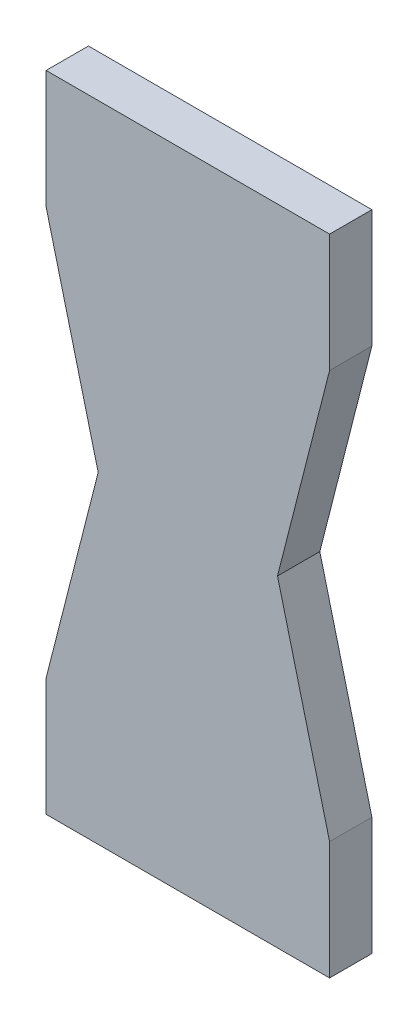
ISO-10303-21;
HEADER;
FILE_DESCRIPTION(('STEP AP214'),'2;1');
FILE_NAME('part.step','',(''),(''),'','','');
FILE_SCHEMA(('AUTOMOTIVE_DESIGN { 1 0 10303 214 1 1 1 1 }'));
ENDSEC;
DATA;
#1=APPLICATION_CONTEXT('core data for automotive mechanical design processes');
#2=APPLICATION_PROTOCOL_DEFINITION('international standard','automotive_design',2000,#1);
#3=PRODUCT_CONTEXT('',#1,'mechanical');
#4=PRODUCT('Part','Part','',(#3));
#5=PRODUCT_RELATED_PRODUCT_CATEGORY('part','',(#4));
#6=PRODUCT_DEFINITION_FORMATION('','',#4);
#7=PRODUCT_DEFINITION_CONTEXT('part definition',#1,'design');
#8=PRODUCT_DEFINITION('design','',#6,#7);
#9=PRODUCT_DEFINITION_SHAPE('','',#8);
#10=(LENGTH_UNIT() NAMED_UNIT(*) SI_UNIT(.MILLI.,.METRE.));
#11=(NAMED_UNIT(*) PLANE_ANGLE_UNIT() SI_UNIT($,.RADIAN.));
#12=(NAMED_UNIT(*) SI_UNIT($,.STERADIAN.) SOLID_ANGLE_UNIT());
#13=UNCERTAINTY_MEASURE_WITH_UNIT(LENGTH_MEASURE(1.E-05),#10,'distance_accuracy_value','');
#14=(GEOMETRIC_REPRESENTATION_CONTEXT(3) GLOBAL_UNCERTAINTY_ASSIGNED_CONTEXT((#13)) GLOBAL_UNIT_ASSIGNED_CONTEXT((#10,
#11,#12)) REPRESENTATION_CONTEXT('',''));
#15=CARTESIAN_POINT('',(0.,0.,0.));
#16=DIRECTION('',(0.,0.,1.));
#17=DIRECTION('',(1.,0.,0.));
#18=AXIS2_PLACEMENT_3D('',#15,#16,#17);
#19=CARTESIAN_POINT('',(25.6255105081812,6.5412487349831,1.97));
#20=DIRECTION('',(0.968930713030858,0.247332313589456,0.));
#21=DIRECTION('',(-0.247332313589456,0.968930713030858,0.));
#22=AXIS2_PLACEMENT_3D('',#19,#20,#21);
#23=PLANE('',#22);
#24=DIRECTION('',(0.247332313589456,-0.968930713030858,0.));
#25=VECTOR('',#24,1.);
#26=CARTESIAN_POINT('',(25.6255105081812,6.5412487349831,0.));
#27=LINE('',#26,#25);
#28=CARTESIAN_POINT('',(20.9826344025264,24.7298355406408,0.));
#29=VERTEX_POINT('',#28);
#30=CARTESIAN_POINT('',(23.4076344025264,15.2298355406408,0.));
#31=VERTEX_POINT('',#30);
#32=EDGE_CURVE('E144',#29,#31,#27,.T.);
#33=ORIENTED_EDGE('',*,*,#32,.F.);
#34=DIRECTION('',(0.,0.,-1.));
#35=VECTOR('',#34,1.);
#36=CARTESIAN_POINT('',(20.9826344025264,24.7298355406408,1.97));
#37=LINE('',#36,#35);
#38=CARTESIAN_POINT('',(20.9826344025264,24.7298355406408,1.97));
#39=VERTEX_POINT('',#38);
#40=EDGE_CURVE('E11',#39,#29,#37,.T.);
#41=ORIENTED_EDGE('',*,*,#40,.F.);
#42=DIRECTION('',(0.247332313589456,-0.968930713030858,0.));
#43=VECTOR('',#42,1.);
#44=CARTESIAN_POINT('',(25.6255105081812,6.5412487349831,1.97));
#45=LINE('',#44,#43);
#46=CARTESIAN_POINT('',(23.4076344025264,15.2298355406408,1.97));
#47=VERTEX_POINT('',#46);
#48=EDGE_CURVE('E197',#39,#47,#45,.T.);
#49=ORIENTED_EDGE('',*,*,#48,.T.);
#50=DIRECTION('',(0.,0.,-1.));
#51=VECTOR('',#50,1.);
#52=CARTESIAN_POINT('',(23.4076344025264,15.2298355406408,1.97));
#53=LINE('',#52,#51);
#54=EDGE_CURVE('E50',#47,#31,#53,.T.);
#55=ORIENTED_EDGE('',*,*,#54,.T.);
#56=EDGE_LOOP('',(#33,#41,#49,#55));
#57=FACE_BOUND('',#56,.T.);
#58=ADVANCED_FACE('F34',(#57),#23,.T.);
#59=CARTESIAN_POINT('',(13.7726054372423,-3.51563875634869,1.97));
#60=DIRECTION('',(-0.968930713030858,0.247332313589456,0.));
#61=DIRECTION('',(-0.247332313589456,-0.968930713030858,0.));
#62=AXIS2_PLACEMENT_3D('',#59,#60,#61);
#63=PLANE('',#62);
#64=DIRECTION('',(0.247332313589456,0.968930713030858,0.));
#65=VECTOR('',#64,1.);
#66=CARTESIAN_POINT('',(13.7726054372423,-3.51563875634869,0.));
#67=LINE('',#66,#65);
#68=CARTESIAN_POINT('',(23.4076344025265,34.2298355406408,0.));
#69=VERTEX_POINT('',#68);
#70=EDGE_CURVE('E146',#29,#69,#67,.T.);
#71=ORIENTED_EDGE('',*,*,#70,.T.);
#72=DIRECTION('',(0.,0.,-1.));
#73=VECTOR('',#72,1.);
#74=CARTESIAN_POINT('',(23.4076344025265,34.2298355406408,1.97));
#75=LINE('',#74,#73);
#76=CARTESIAN_POINT('',(23.4076344025265,34.2298355406408,1.97));
#77=VERTEX_POINT('',#76);
#78=EDGE_CURVE('E42',#77,#69,#75,.T.);
#79=ORIENTED_EDGE('',*,*,#78,.F.);
#80=DIRECTION('',(0.247332313589456,0.968930713030858,0.));
#81=VECTOR('',#80,1.);
#82=CARTESIAN_POINT('',(13.7726054372423,-3.51563875634869,1.97));
#83=LINE('',#82,#81);
#84=EDGE_CURVE('E195',#39,#77,#83,.T.);
#85=ORIENTED_EDGE('',*,*,#84,.F.);
#86=ORIENTED_EDGE('',*,*,#40,.T.);
#87=EDGE_LOOP('',(#71,#79,#85,#86));
#88=FACE_BOUND('',#87,.T.);
#89=ADVANCED_FACE('F184',(#88),#63,.F.);
#90=CARTESIAN_POINT('',(23.4076344025264,0.,1.97));
#91=DIRECTION('',(1.,0.,0.));
#92=DIRECTION('',(0.,0.,-1.));
#93=AXIS2_PLACEMENT_3D('',#90,#91,#92);
#94=PLANE('',#93);
#95=DIRECTION('',(0.,-1.,0.));
#96=VECTOR('',#95,1.);
#97=CARTESIAN_POINT('',(23.4076344025264,0.,0.));
#98=LINE('',#97,#96);
#99=CARTESIAN_POINT('',(23.4076344025264,39.7298355406408,0.));
#100=VERTEX_POINT('',#99);
#101=EDGE_CURVE('E149',#100,#69,#98,.T.);
#102=ORIENTED_EDGE('',*,*,#101,.F.);
#103=DIRECTION('',(0.,0.,-1.));
#104=VECTOR('',#103,1.);
#105=CARTESIAN_POINT('',(23.4076344025264,39.7298355406408,1.97));
#106=LINE('',#105,#104);
#107=CARTESIAN_POINT('',(23.4076344025264,39.7298355406408,1.97));
#108=VERTEX_POINT('',#107);
#109=EDGE_CURVE('E175',#108,#100,#106,.T.);
#110=ORIENTED_EDGE('',*,*,#109,.F.);
#111=DIRECTION('',(0.,-1.,0.));
#112=VECTOR('',#111,1.);
#113=CARTESIAN_POINT('',(23.4076344025264,0.,1.97));
#114=LINE('',#113,#112);
#115=EDGE_CURVE('E140',#108,#77,#114,.T.);
#116=ORIENTED_EDGE('',*,*,#115,.T.);
#117=ORIENTED_EDGE('',*,*,#78,.T.);
#118=EDGE_LOOP('',(#102,#110,#116,#117));
#119=FACE_BOUND('',#118,.T.);
#120=ADVANCED_FACE('F180',(#119),#94,.T.);
#121=CARTESIAN_POINT('',(0.,39.7298355406408,1.97));
#122=DIRECTION('',(0.,1.,0.));
#123=DIRECTION('',(0.,0.,1.));
#124=AXIS2_PLACEMENT_3D('',#121,#122,#123);
#125=PLANE('',#124);
#126=DIRECTION('',(1.,0.,0.));
#127=VECTOR('',#126,1.);
#128=CARTESIAN_POINT('',(0.,39.7298355406408,0.));
#129=LINE('',#128,#127);
#130=CARTESIAN_POINT('',(10.2076344025264,39.7298355406408,0.));
#131=VERTEX_POINT('',#130);
#132=EDGE_CURVE('E152',#131,#100,#129,.T.);
#133=ORIENTED_EDGE('',*,*,#132,.F.);
#134=DIRECTION('',(0.,0.,-1.));
#135=VECTOR('',#134,1.);
#136=CARTESIAN_POINT('',(10.2076344025264,39.7298355406408,1.97));
#137=LINE('',#136,#135);
#138=CARTESIAN_POINT('',(10.2076344025264,39.7298355406408,1.97));
#139=VERTEX_POINT('',#138);
#140=EDGE_CURVE('E173',#139,#131,#137,.T.);
#141=ORIENTED_EDGE('',*,*,#140,.F.);
#142=DIRECTION('',(1.,0.,0.));
#143=VECTOR('',#142,1.);
#144=CARTESIAN_POINT('',(0.,39.7298355406408,1.97));
#145=LINE('',#144,#143);
#146=EDGE_CURVE('E194',#139,#108,#145,.T.);
#147=ORIENTED_EDGE('',*,*,#146,.T.);
#148=ORIENTED_EDGE('',*,*,#109,.T.);
#149=EDGE_LOOP('',(#133,#141,#147,#148));
#150=FACE_BOUND('',#149,.T.);
#151=ADVANCED_FACE('F190',(#150),#125,.T.);
#152=CARTESIAN_POINT('',(10.2076344025264,0.,1.97));
#153=DIRECTION('',(1.,0.,0.));
#154=DIRECTION('',(0.,0.,-1.));
#155=AXIS2_PLACEMENT_3D('',#152,#153,#154);
#156=PLANE('',#155);
#157=DIRECTION('',(0.,-1.,0.));
#158=VECTOR('',#157,1.);
#159=CARTESIAN_POINT('',(10.2076344025264,0.,0.));
#160=LINE('',#159,#158);
#161=CARTESIAN_POINT('',(10.2076344025264,34.2298355406408,0.));
#162=VERTEX_POINT('',#161);
#163=EDGE_CURVE('E156',#131,#162,#160,.T.);
#164=ORIENTED_EDGE('',*,*,#163,.T.);
#165=DIRECTION('',(0.,0.,-1.));
#166=VECTOR('',#165,1.);
#167=CARTESIAN_POINT('',(10.2076344025264,34.2298355406408,1.97));
#168=LINE('',#167,#166);
#169=CARTESIAN_POINT('',(10.2076344025264,34.2298355406408,1.97));
#170=VERTEX_POINT('',#169);
#171=EDGE_CURVE('E171',#170,#162,#168,.T.);
#172=ORIENTED_EDGE('',*,*,#171,.F.);
#173=DIRECTION('',(0.,-1.,0.));
#174=VECTOR('',#173,1.);
#175=CARTESIAN_POINT('',(10.2076344025264,0.,1.97));
#176=LINE('',#175,#174);
#177=EDGE_CURVE('E126',#139,#170,#176,.T.);
#178=ORIENTED_EDGE('',*,*,#177,.F.);
#179=ORIENTED_EDGE('',*,*,#140,.T.);
#180=EDGE_LOOP('',(#164,#172,#178,#179));
#181=FACE_BOUND('',#180,.T.);
#182=ADVANCED_FACE('F207',(#181),#156,.F.);
#183=CARTESIAN_POINT('',(17.7863073406162,4.54018897905204,1.97));
#184=DIRECTION('',(-0.968930713030858,-0.247332313589456,0.));
#185=DIRECTION('',(0.247332313589456,-0.968930713030858,0.));
#186=AXIS2_PLACEMENT_3D('',#183,#184,#185);
#187=PLANE('',#186);
#188=DIRECTION('',(-0.247332313589456,0.968930713030858,0.));
#189=VECTOR('',#188,1.);
#190=CARTESIAN_POINT('',(17.7863073406162,4.54018897905204,0.));
#191=LINE('',#190,#189);
#192=CARTESIAN_POINT('',(12.6326344025264,24.7298355406408,0.));
#193=VERTEX_POINT('',#192);
#194=EDGE_CURVE('E159',#193,#162,#191,.T.);
#195=ORIENTED_EDGE('',*,*,#194,.F.);
#196=DIRECTION('',(0.,0.,-1.));
#197=VECTOR('',#196,1.);
#198=CARTESIAN_POINT('',(12.6326344025264,24.7298355406408,1.97));
#199=LINE('',#198,#197);
#200=CARTESIAN_POINT('',(12.6326344025264,24.7298355406408,1.97));
#201=VERTEX_POINT('',#200);
#202=EDGE_CURVE('E169',#201,#193,#199,.T.);
#203=ORIENTED_EDGE('',*,*,#202,.F.);
#204=DIRECTION('',(-0.247332313589456,0.968930713030858,0.));
#205=VECTOR('',#204,1.);
#206=CARTESIAN_POINT('',(17.7863073406162,4.54018897905204,1.97));
#207=LINE('',#206,#205);
#208=EDGE_CURVE('E200',#201,#170,#207,.T.);
#209=ORIENTED_EDGE('',*,*,#208,.T.);
#210=ORIENTED_EDGE('',*,*,#171,.T.);
#211=EDGE_LOOP('',(#195,#203,#209,#210));
#212=FACE_BOUND('',#211,.T.);
#213=ADVANCED_FACE('F204',(#212),#187,.T.);
#214=CARTESIAN_POINT('',(5.9334022696773,-1.51457900041763,1.97));
#215=DIRECTION('',(0.968930713030858,-0.247332313589456,0.));
#216=DIRECTION('',(0.247332313589456,0.968930713030858,0.));
#217=AXIS2_PLACEMENT_3D('',#214,#215,#216);
#218=PLANE('',#217);
#219=DIRECTION('',(-0.247332313589456,-0.968930713030858,0.));
#220=VECTOR('',#219,1.);
#221=CARTESIAN_POINT('',(5.9334022696773,-1.51457900041763,0.));
#222=LINE('',#221,#220);
#223=CARTESIAN_POINT('',(10.2076344025264,15.2298355406409,0.));
#224=VERTEX_POINT('',#223);
#225=EDGE_CURVE('E162',#193,#224,#222,.T.);
#226=ORIENTED_EDGE('',*,*,#225,.T.);
#227=DIRECTION('',(0.,0.,-1.));
#228=VECTOR('',#227,1.);
#229=CARTESIAN_POINT('',(10.2076344025264,15.2298355406409,1.97));
#230=LINE('',#229,#228);
#231=CARTESIAN_POINT('',(10.2076344025264,15.2298355406409,1.97));
#232=VERTEX_POINT('',#231);
#233=EDGE_CURVE('E134',#232,#224,#230,.T.);
#234=ORIENTED_EDGE('',*,*,#233,.F.);
#235=DIRECTION('',(-0.247332313589456,-0.968930713030858,0.));
#236=VECTOR('',#235,1.);
#237=CARTESIAN_POINT('',(5.9334022696773,-1.51457900041763,1.97));
#238=LINE('',#237,#236);
#239=EDGE_CURVE('E121',#201,#232,#238,.T.);
#240=ORIENTED_EDGE('',*,*,#239,.F.);
#241=ORIENTED_EDGE('',*,*,#202,.T.);
#242=EDGE_LOOP('',(#226,#234,#240,#241));
#243=FACE_BOUND('',#242,.T.);
#244=ADVANCED_FACE('F210',(#243),#218,.F.);
#245=CARTESIAN_POINT('',(10.2076344025264,9.72983554064084,0.));
#246=VERTEX_POINT('',#245);
#247=EDGE_CURVE('E131',#224,#246,#160,.T.);
#248=ORIENTED_EDGE('',*,*,#247,.T.);
#249=DIRECTION('',(0.,0.,-1.));
#250=VECTOR('',#249,1.);
#251=CARTESIAN_POINT('',(10.2076344025264,9.72983554064084,1.97));
#252=LINE('',#251,#250);
#253=CARTESIAN_POINT('',(10.2076344025264,9.72983554064084,1.97));
#254=VERTEX_POINT('',#253);
#255=EDGE_CURVE('E128',#254,#246,#252,.T.);
#256=ORIENTED_EDGE('',*,*,#255,.F.);
#257=EDGE_CURVE('E112',#232,#254,#176,.T.);
#258=ORIENTED_EDGE('',*,*,#257,.F.);
#259=ORIENTED_EDGE('',*,*,#233,.T.);
#260=EDGE_LOOP('',(#248,#256,#258,#259));
#261=FACE_BOUND('',#260,.T.);
#262=ADVANCED_FACE('F129',(#261),#156,.F.);
#263=CARTESIAN_POINT('',(0.,9.72983554064084,1.97));
#264=DIRECTION('',(0.,1.,0.));
#265=DIRECTION('',(-1.,0.,0.));
#266=AXIS2_PLACEMENT_3D('',#263,#264,#265);
#267=PLANE('',#266);
#268=DIRECTION('',(1.,0.,0.));
#269=VECTOR('',#268,1.);
#270=CARTESIAN_POINT('',(0.,9.72983554064084,0.));
#271=LINE('',#270,#269);
#272=CARTESIAN_POINT('',(23.4076344025264,9.72983554064083,0.));
#273=VERTEX_POINT('',#272);
#274=EDGE_CURVE('E164',#246,#273,#271,.T.);
#275=ORIENTED_EDGE('',*,*,#274,.T.);
#276=DIRECTION('',(0.,0.,-1.));
#277=VECTOR('',#276,1.);
#278=CARTESIAN_POINT('',(23.4076344025264,9.72983554064083,1.97));
#279=LINE('',#278,#277);
#280=CARTESIAN_POINT('',(23.4076344025264,9.72983554064083,1.97));
#281=VERTEX_POINT('',#280);
#282=EDGE_CURVE('E82',#281,#273,#279,.T.);
#283=ORIENTED_EDGE('',*,*,#282,.F.);
#284=DIRECTION('',(1.,0.,0.));
#285=VECTOR('',#284,1.);
#286=CARTESIAN_POINT('',(0.,9.72983554064084,1.97));
#287=LINE('',#286,#285);
#288=EDGE_CURVE('E118',#254,#281,#287,.T.);
#289=ORIENTED_EDGE('',*,*,#288,.F.);
#290=ORIENTED_EDGE('',*,*,#255,.T.);
#291=EDGE_LOOP('',(#275,#283,#289,#290));
#292=FACE_BOUND('',#291,.T.);
#293=ADVANCED_FACE('F136',(#292),#267,.F.);
#294=EDGE_CURVE('E153',#31,#273,#98,.T.);
#295=ORIENTED_EDGE('',*,*,#294,.F.);
#296=ORIENTED_EDGE('',*,*,#54,.F.);
#297=EDGE_CURVE('E137',#47,#281,#114,.T.);
#298=ORIENTED_EDGE('',*,*,#297,.T.);
#299=ORIENTED_EDGE('',*,*,#282,.T.);
#300=EDGE_LOOP('',(#295,#296,#298,#299));
#301=FACE_BOUND('',#300,.T.);
#302=ADVANCED_FACE('F224',(#301),#94,.T.);
#303=CARTESIAN_POINT('',(0.,0.,1.97));
#304=DIRECTION('',(0.,0.,1.));
#305=DIRECTION('',(1.,0.,0.));
#306=AXIS2_PLACEMENT_3D('',#303,#304,#305);
#307=PLANE('',#306);
#308=ORIENTED_EDGE('',*,*,#48,.F.);
#309=ORIENTED_EDGE('',*,*,#84,.T.);
#310=ORIENTED_EDGE('',*,*,#115,.F.);
#311=ORIENTED_EDGE('',*,*,#146,.F.);
#312=ORIENTED_EDGE('',*,*,#177,.T.);
#313=ORIENTED_EDGE('',*,*,#208,.F.);
#314=ORIENTED_EDGE('',*,*,#239,.T.);
#315=ORIENTED_EDGE('',*,*,#257,.T.);
#316=ORIENTED_EDGE('',*,*,#288,.T.);
#317=ORIENTED_EDGE('',*,*,#297,.F.);
#318=EDGE_LOOP('',(#308,#309,#310,#311,#312,#313,#314,#315,#316,#317));
#319=FACE_BOUND('',#318,.T.);
#320=ADVANCED_FACE('F115',(#319),#307,.T.);
#321=CARTESIAN_POINT('',(0.,0.,0.));
#322=DIRECTION('',(0.,0.,1.));
#323=DIRECTION('',(1.,0.,0.));
#324=AXIS2_PLACEMENT_3D('',#321,#322,#323);
#325=PLANE('',#324);
#326=ORIENTED_EDGE('',*,*,#32,.T.);
#327=ORIENTED_EDGE('',*,*,#294,.T.);
#328=ORIENTED_EDGE('',*,*,#274,.F.);
#329=ORIENTED_EDGE('',*,*,#247,.F.);
#330=ORIENTED_EDGE('',*,*,#225,.F.);
#331=ORIENTED_EDGE('',*,*,#194,.T.);
#332=ORIENTED_EDGE('',*,*,#163,.F.);
#333=ORIENTED_EDGE('',*,*,#132,.T.);
#334=ORIENTED_EDGE('',*,*,#101,.T.);
#335=ORIENTED_EDGE('',*,*,#70,.F.);
#336=EDGE_LOOP('',(#326,#327,#328,#329,#330,#331,#332,#333,#334,#335));
#337=FACE_BOUND('',#336,.T.);
#338=ADVANCED_FACE('F186',(#337),#325,.F.);
#339=CLOSED_SHELL('',(#58,#89,#120,#151,#182,#213,#244,#262,#293,#302,#320,#338));
#340=MANIFOLD_SOLID_BREP('B2',#339);
#341=ADVANCED_BREP_SHAPE_REPRESENTATION('',(#18,#340),#14);
#342=SHAPE_DEFINITION_REPRESENTATION(#9,#341);
ENDSEC;
END-ISO-10303-21;
